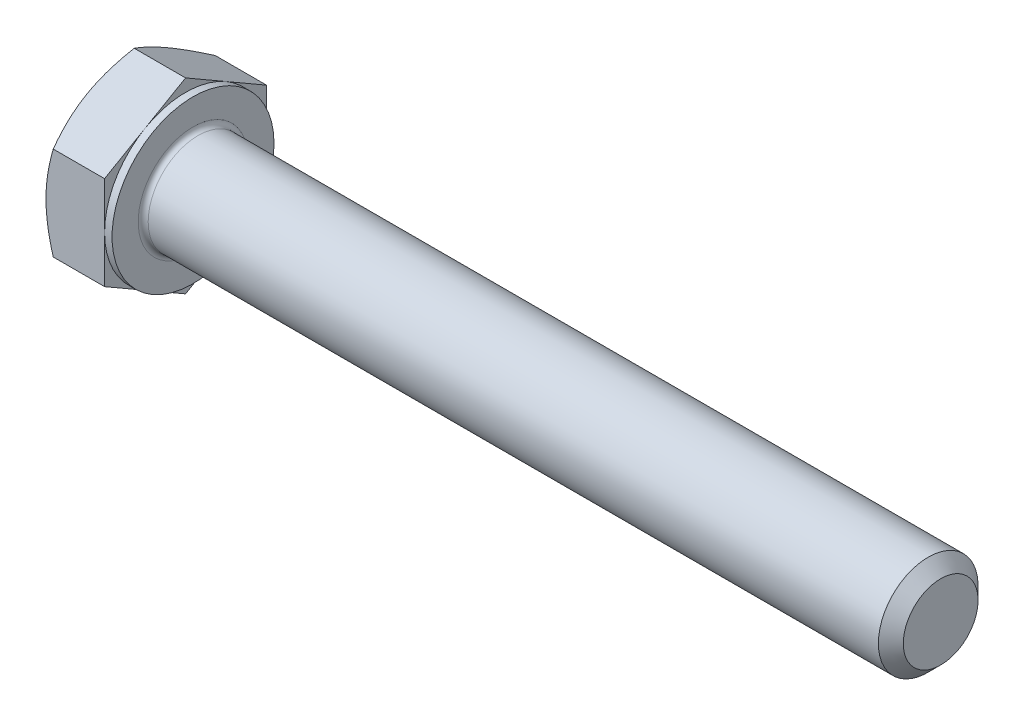
ISO-10303-21;
HEADER;
FILE_DESCRIPTION(('STEP AP214'),'2;1');
FILE_NAME('part.step','',(''),(''),'','','');
FILE_SCHEMA(('AUTOMOTIVE_DESIGN { 1 0 10303 214 1 1 1 1 }'));
ENDSEC;
DATA;
#1=APPLICATION_CONTEXT('core data for automotive mechanical design processes');
#2=APPLICATION_PROTOCOL_DEFINITION('international standard','automotive_design',2000,#1);
#3=PRODUCT_CONTEXT('',#1,'mechanical');
#4=PRODUCT('Part','Part','',(#3));
#5=PRODUCT_RELATED_PRODUCT_CATEGORY('part','',(#4));
#6=PRODUCT_DEFINITION_FORMATION('','',#4);
#7=PRODUCT_DEFINITION_CONTEXT('part definition',#1,'design');
#8=PRODUCT_DEFINITION('design','',#6,#7);
#9=PRODUCT_DEFINITION_SHAPE('','',#8);
#10=(LENGTH_UNIT() NAMED_UNIT(*) SI_UNIT(.MILLI.,.METRE.));
#11=(NAMED_UNIT(*) PLANE_ANGLE_UNIT() SI_UNIT($,.RADIAN.));
#12=(NAMED_UNIT(*) SI_UNIT($,.STERADIAN.) SOLID_ANGLE_UNIT());
#13=UNCERTAINTY_MEASURE_WITH_UNIT(LENGTH_MEASURE(1.E-05),#10,'distance_accuracy_value','');
#14=(GEOMETRIC_REPRESENTATION_CONTEXT(3) GLOBAL_UNCERTAINTY_ASSIGNED_CONTEXT((#13)) GLOBAL_UNIT_ASSIGNED_CONTEXT((#10,
#11,#12)) REPRESENTATION_CONTEXT('',''));
#15=CARTESIAN_POINT('',(0.,0.,0.));
#16=DIRECTION('',(0.,0.,1.));
#17=DIRECTION('',(1.,0.,0.));
#18=AXIS2_PLACEMENT_3D('',#15,#16,#17);
#19=CARTESIAN_POINT('',(5.3,3.75277674973256,-6.5));
#20=DIRECTION('',(0.,-0.866025403784438,0.500000000000001));
#21=DIRECTION('',(0.,-0.500000000000001,-0.866025403784438));
#22=AXIS2_PLACEMENT_3D('',#19,#20,#21);
#23=PLANE('',#22);
#24=DIRECTION('',(0.,0.500000000000001,0.866025403784438));
#25=VECTOR('',#24,1.);
#26=CARTESIAN_POINT('',(4.7,3.75277674973256,-6.5));
#27=LINE('',#26,#25);
#28=CARTESIAN_POINT('',(4.7,3.75277674973256,-6.5));
#29=VERTEX_POINT('',#28);
#30=CARTESIAN_POINT('',(4.7,5.62916512459885,-3.25));
#31=VERTEX_POINT('',#30);
#32=EDGE_CURVE('E176',#29,#31,#27,.T.);
#33=ORIENTED_EDGE('',*,*,#32,.F.);
#34=DIRECTION('',(-1.,0.,0.));
#35=VECTOR('',#34,1.);
#36=CARTESIAN_POINT('',(5.3,3.75277674973256,-6.5));
#37=LINE('',#36,#35);
#38=CARTESIAN_POINT('',(0.580556583600761,3.75277674973256,-6.5));
#39=VERTEX_POINT('',#38);
#40=EDGE_CURVE('E304',#29,#39,#37,.T.);
#41=ORIENTED_EDGE('',*,*,#40,.T.);
#42=CARTESIAN_POINT('',(0.580623251805869,7.50566896951898,0.0002));
#43=CARTESIAN_POINT('',(0.533004423075487,7.4231786300702,-0.14267745905888));
#44=CARTESIAN_POINT('',(0.487546700602708,7.34038072665458,-0.286087634534913));
#45=CARTESIAN_POINT('',(0.401548682023047,7.17411251123976,-0.574072631317195));
#46=CARTESIAN_POINT('',(0.361010507228027,7.09064192560665,-0.718647926571264));
#47=CARTESIAN_POINT('',(0.24757100112321,6.83889369625719,-1.15468865052003));
#48=CARTESIAN_POINT('',(0.183047807128741,6.66962231516081,-1.44787528284632));
#49=CARTESIAN_POINT('',(0.107386583547492,6.41631077211555,-1.88662374554437));
#50=CARTESIAN_POINT('',(0.0858328564569881,6.33302748139454,-2.03087463649469));
#51=CARTESIAN_POINT('',(0.0496903146061193,6.16608458377293,-2.32002821713809));
#52=CARTESIAN_POINT('',(0.0351008844596669,6.08242501078143,-2.46493084809889));
#53=CARTESIAN_POINT('',(0.0132587525073471,5.91496056339806,-2.75498777942832));
#54=CARTESIAN_POINT('',(0.00599772432210794,5.8311559625217,-2.90014160605421));
#55=CARTESIAN_POINT('',(-0.00103969741776869,5.66347396979287,-3.19057533697495));
#56=CARTESIAN_POINT('',(-0.000816322187795487,5.5795965802691,-3.33585523723636));
#57=CARTESIAN_POINT('',(0.010083458515165,5.34979921898453,-3.73387594242649));
#58=CARTESIAN_POINT('',(0.028381817869413,5.20395446807007,-3.98648646102757));
#59=CARTESIAN_POINT('',(0.0864063414576743,4.91323365606635,-4.49002967823568));
#60=CARTESIAN_POINT('',(0.126152338538243,4.76835861741226,-4.74096060593308));
#61=CARTESIAN_POINT('',(0.225505903202148,4.47705272008731,-5.24551722064432));
#62=CARTESIAN_POINT('',(0.285534425638025,4.33065861912702,-5.49907924143591));
#63=CARTESIAN_POINT('',(0.421774992509866,4.04005357906493,-6.00242193575904));
#64=CARTESIAN_POINT('',(0.497955034163591,3.89583891821181,-6.25220905555296));
#65=CARTESIAN_POINT('',(0.580623251805865,3.75266127967873,-6.5002));
#66=B_SPLINE_CURVE_WITH_KNOTS('',3,(#42,#43,#44,#45,#46,#47,#48,#49,#50,#51,#52,#53,#54,#55,#56,
#57,#58,#59,#60,#61,#62,#63,#64,#65),.UNSPECIFIED.,.F.,.F.,(4,2,2,2,2,2,2,2,2,2,2,4),(0.,
0.515105052395588,1.03043143507525,2.06322554824262,2.56697389547996,3.07067772176454,
3.57380860368928,4.0769239424252,4.9527935470566,5.82947446853466,6.72559912449737,
7.61996451221046),.UNSPECIFIED.);
#67=CARTESIAN_POINT('',(0.,5.62916512459885,-3.25000000000001));
#68=VERTEX_POINT('',#67);
#69=EDGE_CURVE('E231',#68,#39,#66,.T.);
#70=ORIENTED_EDGE('',*,*,#69,.F.);
#71=CARTESIAN_POINT('',(0.580556583600765,7.50555349946514,0.));
#72=VERTEX_POINT('',#71);
#73=EDGE_CURVE('E67',#72,#68,#66,.T.);
#74=ORIENTED_EDGE('',*,*,#73,.F.);
#75=DIRECTION('',(-1.,0.,0.));
#76=VECTOR('',#75,1.);
#77=CARTESIAN_POINT('',(5.3,7.50555349946514,0.));
#78=LINE('',#77,#76);
#79=CARTESIAN_POINT('',(4.7,7.50555349946514,0.));
#80=VERTEX_POINT('',#79);
#81=EDGE_CURVE('E296',#80,#72,#78,.T.);
#82=ORIENTED_EDGE('',*,*,#81,.F.);
#83=EDGE_CURVE('E174',#31,#80,#27,.T.);
#84=ORIENTED_EDGE('',*,*,#83,.F.);
#85=EDGE_LOOP('',(#33,#41,#70,#74,#82,#84));
#86=FACE_BOUND('',#85,.T.);
#87=ADVANCED_FACE('F44',(#86),#23,.F.);
#88=CARTESIAN_POINT('',(5.3,7.50555349946514,0.));
#89=DIRECTION('',(0.,-0.866025403784438,-0.500000000000001));
#90=DIRECTION('',(0.,0.500000000000001,-0.866025403784438));
#91=AXIS2_PLACEMENT_3D('',#88,#89,#90);
#92=PLANE('',#91);
#93=DIRECTION('',(0.,-0.500000000000001,0.866025403784438));
#94=VECTOR('',#93,1.);
#95=CARTESIAN_POINT('',(4.7,7.50555349946514,0.));
#96=LINE('',#95,#94);
#97=CARTESIAN_POINT('',(4.7,5.62916512459885,3.25000000000001));
#98=VERTEX_POINT('',#97);
#99=EDGE_CURVE('E173',#80,#98,#96,.T.);
#100=ORIENTED_EDGE('',*,*,#99,.F.);
#101=ORIENTED_EDGE('',*,*,#81,.T.);
#102=CARTESIAN_POINT('',(0.580623251805865,3.75266127967872,6.5002));
#103=CARTESIAN_POINT('',(0.533004423075483,3.8351516191275,6.35732254094112));
#104=CARTESIAN_POINT('',(0.487546700602704,3.91794952254312,6.21391236546509));
#105=CARTESIAN_POINT('',(0.401548682023044,4.08421773795794,5.9259273686828));
#106=CARTESIAN_POINT('',(0.361010507228023,4.16768832359105,5.78135207342873));
#107=CARTESIAN_POINT('',(0.247571001123207,4.41943655294051,5.34531134947996));
#108=CARTESIAN_POINT('',(0.183047807128738,4.58870793403689,5.05212471715368));
#109=CARTESIAN_POINT('',(0.10738658354749,4.84201947708215,4.61337625445563));
#110=CARTESIAN_POINT('',(0.0858328564569865,4.92530276780316,4.46912536350531));
#111=CARTESIAN_POINT('',(0.0496903146061183,5.09224566542477,4.17997178286191));
#112=CARTESIAN_POINT('',(0.035100884459666,5.17590523841627,4.03506915190111));
#113=CARTESIAN_POINT('',(0.0132587525073465,5.34336968579964,3.74501222057168));
#114=CARTESIAN_POINT('',(0.00599772432210779,5.427174286676,3.59985839394579));
#115=CARTESIAN_POINT('',(-0.00103969741776854,5.59485627940483,3.30942466302505));
#116=CARTESIAN_POINT('',(-0.000816322187795452,5.6787336689286,3.16414476276364));
#117=CARTESIAN_POINT('',(0.010083458515165,5.90853103021317,2.76612405757351));
#118=CARTESIAN_POINT('',(0.0283818178694132,6.05437578112763,2.51351353897243));
#119=CARTESIAN_POINT('',(0.0864063414576753,6.34509659313135,2.00997032176432));
#120=CARTESIAN_POINT('',(0.126152338538245,6.48997163178545,1.75903939406692));
#121=CARTESIAN_POINT('',(0.22550590320215,6.78127752911039,1.25448277935568));
#122=CARTESIAN_POINT('',(0.285534425638028,6.92767163007068,1.00092075856409));
#123=CARTESIAN_POINT('',(0.42177499250987,7.21827667013277,0.497578064240955));
#124=CARTESIAN_POINT('',(0.497955034163595,7.36249133098589,0.247790944447036));
#125=CARTESIAN_POINT('',(0.580623251805869,7.50566896951898,-0.000200000000000213));
#126=B_SPLINE_CURVE_WITH_KNOTS('',3,(#102,#103,#104,#105,#106,#107,#108,#109,#110,#111,#112,
#113,#114,#115,#116,#117,#118,#119,#120,#121,#122,#123,#124,#125),.UNSPECIFIED.,.F.,.F.,(4,2,2,
2,2,2,2,2,2,2,2,4),(0.,0.515105052395587,1.03043143507524,2.06322554824262,2.56697389547996,
3.07067772176454,3.57380860368928,4.0769239424252,4.9527935470566,5.82947446853466,
6.72559912449737,7.61996451221046),.UNSPECIFIED.);
#127=CARTESIAN_POINT('',(0.,5.62916512459885,3.25000000000001));
#128=VERTEX_POINT('',#127);
#129=EDGE_CURVE('E228',#128,#72,#126,.T.);
#130=ORIENTED_EDGE('',*,*,#129,.F.);
#131=CARTESIAN_POINT('',(0.58055658360076,3.75277674973256,6.5));
#132=VERTEX_POINT('',#131);
#133=EDGE_CURVE('E242',#132,#128,#126,.T.);
#134=ORIENTED_EDGE('',*,*,#133,.F.);
#135=DIRECTION('',(-1.,0.,0.));
#136=VECTOR('',#135,1.);
#137=CARTESIAN_POINT('',(5.3,3.75277674973256,6.5));
#138=LINE('',#137,#136);
#139=CARTESIAN_POINT('',(4.7,3.75277674973256,6.5));
#140=VERTEX_POINT('',#139);
#141=EDGE_CURVE('E298',#140,#132,#138,.T.);
#142=ORIENTED_EDGE('',*,*,#141,.F.);
#143=EDGE_CURVE('E141',#98,#140,#96,.T.);
#144=ORIENTED_EDGE('',*,*,#143,.F.);
#145=EDGE_LOOP('',(#100,#101,#130,#134,#142,#144));
#146=FACE_BOUND('',#145,.T.);
#147=ADVANCED_FACE('F249',(#146),#92,.F.);
#148=CARTESIAN_POINT('',(5.3,3.75277674973256,6.5));
#149=DIRECTION('',(0.,0.,-1.));
#150=DIRECTION('',(0.,1.,0.));
#151=AXIS2_PLACEMENT_3D('',#148,#149,#150);
#152=PLANE('',#151);
#153=DIRECTION('',(0.,-1.,0.));
#154=VECTOR('',#153,1.);
#155=CARTESIAN_POINT('',(4.7,3.75277674973256,6.5));
#156=LINE('',#155,#154);
#157=CARTESIAN_POINT('',(4.7,0.,6.5));
#158=VERTEX_POINT('',#157);
#159=EDGE_CURVE('E135',#140,#158,#156,.T.);
#160=ORIENTED_EDGE('',*,*,#159,.F.);
#161=ORIENTED_EDGE('',*,*,#141,.T.);
#162=CARTESIAN_POINT('',(3.18835311590246,-10.1137456678934,6.5));
#163=CARTESIAN_POINT('',(3.05034774010468,-9.82952666322138,6.5));
#164=CARTESIAN_POINT('',(2.91365616489938,-9.54465869649274,6.5));
#165=CARTESIAN_POINT('',(2.64363899497541,-8.97327978057922,6.5));
#166=CARTESIAN_POINT('',(2.51031392459097,-8.68676858388472,6.5));
#167=CARTESIAN_POINT('',(2.24710473482719,-8.11029837842689,6.5));
#168=CARTESIAN_POINT('',(2.1172430043868,-7.82032911201512,6.5));
#169=CARTESIAN_POINT('',(1.86279082826903,-7.2380954102234,6.5));
#170=CARTESIAN_POINT('',(1.73820013554674,-6.94583108317207,6.5));
#171=CARTESIAN_POINT('',(1.49176685426961,-6.34906440963036,6.5));
#172=CARTESIAN_POINT('',(1.37014257641265,-6.04447142288872,6.5));
#173=CARTESIAN_POINT('',(1.13601865758149,-5.43173420957315,6.5));
#174=CARTESIAN_POINT('',(1.02352003558022,-5.12358959079846,6.5));
#175=CARTESIAN_POINT('',(0.810575368239917,-4.5038256978226,6.5));
#176=CARTESIAN_POINT('',(0.710105232302005,-4.19221478266993,6.5));
#177=CARTESIAN_POINT('',(0.524420166144454,-3.56452019206012,6.5));
#178=CARTESIAN_POINT('',(0.439200468206418,-3.24843794792921,6.5));
#179=CARTESIAN_POINT('',(0.288524223401198,-2.61335465712783,6.5));
#180=CARTESIAN_POINT('',(0.222961865744749,-2.29437912059505,6.5));
#181=CARTESIAN_POINT('',(0.115312883130725,-1.65238219405863,6.5));
#182=CARTESIAN_POINT('',(0.0732239014690639,-1.3293612135443,6.5));
#183=CARTESIAN_POINT('',(0.0304887136381667,-0.845231171839986,6.5));
#184=CARTESIAN_POINT('',(0.0196493434273843,-0.684982209663103,6.5));
#185=CARTESIAN_POINT('',(0.00475298486143982,-0.36416234906546,6.5));
#186=CARTESIAN_POINT('',(0.000695882908832042,-0.203591456081879,6.5));
#187=CARTESIAN_POINT('',(-0.000531597190094996,0.117577430374297,6.5));
#188=CARTESIAN_POINT('',(0.00229809017012694,0.278175424090143,6.5));
#189=CARTESIAN_POINT('',(0.0147726845547639,0.599108972823505,6.5));
#190=CARTESIAN_POINT('',(0.0244179260500518,0.759444514574217,6.5));
#191=CARTESIAN_POINT('',(0.0554961939343001,1.14369946602534,6.5));
#192=CARTESIAN_POINT('',(0.0801030490514518,1.36736763045086,6.5));
#193=CARTESIAN_POINT('',(0.141246537453378,1.81305591311688,6.5));
#194=CARTESIAN_POINT('',(0.177784759614452,2.03507580783108,6.5));
#195=CARTESIAN_POINT('',(0.303360001332115,2.69839633433796,6.5));
#196=CARTESIAN_POINT('',(0.408335815147595,3.13672010374357,6.5));
#197=CARTESIAN_POINT('',(0.59056459313494,3.79232112918118,6.5));
#198=CARTESIAN_POINT('',(0.656313198979091,4.01299150874073,6.5));
#199=CARTESIAN_POINT('',(0.794681634200732,4.45218859008391,6.5));
#200=CARTESIAN_POINT('',(0.867301513122617,4.67071527639819,6.5));
#201=CARTESIAN_POINT('',(1.01824353854295,5.10569490252726,6.5));
#202=CARTESIAN_POINT('',(1.09656388232839,5.32214847365075,6.5));
#203=CARTESIAN_POINT('',(1.25798086164821,5.75325725773039,6.5));
#204=CARTESIAN_POINT('',(1.34107741035995,5.96791250329556,6.5));
#205=CARTESIAN_POINT('',(1.56029019583041,6.51888445936372,6.5));
#206=CARTESIAN_POINT('',(1.69936356666534,6.85402316813627,6.5));
#207=CARTESIAN_POINT('',(1.98501958087353,7.52109583939393,6.5));
#208=CARTESIAN_POINT('',(2.13160288780791,7.85302951559933,6.5));
#209=CARTESIAN_POINT('',(2.43059748044951,8.51437865518657,6.5));
#210=CARTESIAN_POINT('',(2.58301057596959,8.84379329784093,6.5));
#211=CARTESIAN_POINT('',(2.89234869374926,9.50047798683784,6.5));
#212=CARTESIAN_POINT('',(3.04927357220058,9.82774810112757,6.5));
#213=CARTESIAN_POINT('',(3.36692013130636,10.4809971975748,6.5));
#214=CARTESIAN_POINT('',(3.52764676491733,10.8069737667408,6.5));
#215=CARTESIAN_POINT('',(3.85198555554899,11.4574882901034,6.5));
#216=CARTESIAN_POINT('',(4.01559773123065,11.7820262349792,6.5));
#217=CARTESIAN_POINT('',(4.50986185003773,12.7537468114441,6.5));
#218=CARTESIAN_POINT('',(4.84399997978541,13.3991555932469,6.5));
#219=CARTESIAN_POINT('',(5.48575990265919,14.6239779290894,6.5));
#220=CARTESIAN_POINT('',(5.79279643372278,15.2036995760604,6.5));
#221=CARTESIAN_POINT('',(6.4106918822763,16.3611382637875,6.5));
#222=CARTESIAN_POINT('',(6.72155099010109,16.938855202873,6.5));
#223=CARTESIAN_POINT('',(7.34519775439014,18.0910273555999,6.5));
#224=CARTESIAN_POINT('',(7.65797694168864,18.665487160613,6.5));
#225=CARTESIAN_POINT('',(8.28574397153078,19.8131486204439,6.5));
#226=CARTESIAN_POINT('',(8.60073166294279,20.3863503578957,6.5));
#227=CARTESIAN_POINT('',(8.91652967168741,20.9591024521449,6.5));
#228=B_SPLINE_CURVE_WITH_KNOTS('',3,(#162,#163,#164,#165,#166,#167,#168,#169,#170,#171,#172,
#173,#174,#175,#176,#177,#178,#179,#180,#181,#182,#183,#184,#185,#186,#187,#188,#189,#190,#191,
#192,#193,#194,#195,#196,#197,#198,#199,#200,#201,#202,#203,#204,#205,#206,#207,#208,#209,#210,
#211,#212,#213,#214,#215,#216,#217,#218,#219,#220,#221,#222,#223,#224,#225,#226,#227),
.UNSPECIFIED.,.F.,.F.,(4,2,2,2,2,2,2,2,2,2,2,2,2,2,2,2,2,2,2,2,2,2,2,2,2,2,2,2,2,2,2,2,4),(0.,
0.947868666702312,1.89588406483492,2.84900320930536,3.80207763304315,4.78589774082711,
5.76982755141752,6.75175256246685,7.73337005764394,8.70960474890991,9.68574140951124,
10.1674651053568,10.6491807326436,11.1309009419855,11.6126447932157,12.287317572382,
12.9620802330383,14.312318438093,15.0030310344276,15.6937486114326,16.3842486973571,
17.0747362352244,18.1631508683747,19.2516618378194,20.3405135142583,21.4293305231019,
22.5196540547637,23.6099846401957,25.7902468235016,27.7582608872418,29.7263733429304,
31.6886408595598,33.6507753806319),.UNSPECIFIED.);
#229=CARTESIAN_POINT('',(0.,0.,6.5));
#230=VERTEX_POINT('',#229);
#231=EDGE_CURVE('E243',#230,#132,#228,.T.);
#232=ORIENTED_EDGE('',*,*,#231,.F.);
#233=CARTESIAN_POINT('',(0.580556583600765,-3.75277674973258,6.5));
#234=VERTEX_POINT('',#233);
#235=EDGE_CURVE('E305',#234,#230,#228,.T.);
#236=ORIENTED_EDGE('',*,*,#235,.F.);
#237=DIRECTION('',(-1.,0.,0.));
#238=VECTOR('',#237,1.);
#239=CARTESIAN_POINT('',(5.3,-3.75277674973258,6.5));
#240=LINE('',#239,#238);
#241=CARTESIAN_POINT('',(4.7,-3.75277674973258,6.5));
#242=VERTEX_POINT('',#241);
#243=EDGE_CURVE('E167',#242,#234,#240,.T.);
#244=ORIENTED_EDGE('',*,*,#243,.F.);
#245=EDGE_CURVE('E145',#158,#242,#156,.T.);
#246=ORIENTED_EDGE('',*,*,#245,.F.);
#247=EDGE_LOOP('',(#160,#161,#232,#236,#244,#246));
#248=FACE_BOUND('',#247,.T.);
#249=ADVANCED_FACE('F165',(#248),#152,.F.);
#250=CARTESIAN_POINT('',(5.3,-7.50555349946515,0.));
#251=DIRECTION('',(0.,0.866025403784438,-0.500000000000001));
#252=DIRECTION('',(0.,0.500000000000001,0.866025403784438));
#253=AXIS2_PLACEMENT_3D('',#250,#251,#252);
#254=PLANE('',#253);
#255=DIRECTION('',(0.,-0.500000000000001,-0.866025403784438));
#256=VECTOR('',#255,1.);
#257=CARTESIAN_POINT('',(4.7,-7.50555349946515,0.));
#258=LINE('',#257,#256);
#259=CARTESIAN_POINT('',(4.7,-5.62916512459885,3.25));
#260=VERTEX_POINT('',#259);
#261=EDGE_CURVE('E152',#242,#260,#258,.T.);
#262=ORIENTED_EDGE('',*,*,#261,.F.);
#263=ORIENTED_EDGE('',*,*,#243,.T.);
#264=CARTESIAN_POINT('',(0.580623251805877,-7.50566896951899,-0.000199999999999834));
#265=CARTESIAN_POINT('',(0.533004423075495,-7.42317863007021,0.14267745905888));
#266=CARTESIAN_POINT('',(0.487546700602716,-7.3403807266546,0.286087634534913));
#267=CARTESIAN_POINT('',(0.401548682023055,-7.17411251123977,0.574072631317195));
#268=CARTESIAN_POINT('',(0.361010507228034,-7.09064192560666,0.718647926571265));
#269=CARTESIAN_POINT('',(0.247571001123217,-6.8388936962572,1.15468865052004));
#270=CARTESIAN_POINT('',(0.183047807128748,-6.66962231516082,1.44787528284632));
#271=CARTESIAN_POINT('',(0.107386583547499,-6.41631077211556,1.88662374554438));
#272=CARTESIAN_POINT('',(0.0858328564569948,-6.33302748139455,2.03087463649469));
#273=CARTESIAN_POINT('',(0.049690314606126,-6.16608458377294,2.32002821713809));
#274=CARTESIAN_POINT('',(0.0351008844596736,-6.08242501078144,2.46493084809889));
#275=CARTESIAN_POINT('',(0.0132587525073536,-5.91496056339808,2.75498777942833));
#276=CARTESIAN_POINT('',(0.00599772432211453,-5.83115596252171,2.90014160605422));
#277=CARTESIAN_POINT('',(-0.001039697417762,-5.66347396979288,3.19057533697495));
#278=CARTESIAN_POINT('',(-0.000816322187788739,-5.57959658026911,3.33585523723636));
#279=CARTESIAN_POINT('',(0.0100834585151718,-5.34979921898454,3.7338759424265));
#280=CARTESIAN_POINT('',(0.0283818178694196,-5.20395446807008,3.98648646102758));
#281=CARTESIAN_POINT('',(0.0864063414576807,-4.91323365606637,4.49002967823568));
#282=CARTESIAN_POINT('',(0.12615233853825,-4.76835861741227,4.74096060593309));
#283=CARTESIAN_POINT('',(0.225505903202154,-4.47705272008733,5.24551722064432));
#284=CARTESIAN_POINT('',(0.28553442563803,-4.33065861912704,5.49907924143592));
#285=CARTESIAN_POINT('',(0.421774992509871,-4.04005357906495,6.00242193575905));
#286=CARTESIAN_POINT('',(0.497955034163595,-3.89583891821182,6.25220905555296));
#287=CARTESIAN_POINT('',(0.580623251805869,-3.75266127967874,6.5002));
#288=B_SPLINE_CURVE_WITH_KNOTS('',3,(#264,#265,#266,#267,#268,#269,#270,#271,#272,#273,#274,
#275,#276,#277,#278,#279,#280,#281,#282,#283,#284,#285,#286,#287),.UNSPECIFIED.,.F.,.F.,(4,2,2,
2,2,2,2,2,2,2,2,4),(0.,0.515105052395588,1.03043143507525,2.06322554824263,2.56697389547997,
3.07067772176454,3.57380860368929,4.07692394242521,4.95279354705661,5.82947446853467,
6.72559912449737,7.61996451221046),.UNSPECIFIED.);
#289=CARTESIAN_POINT('',(0.,-5.62916512459885,3.25000000000001));
#290=VERTEX_POINT('',#289);
#291=EDGE_CURVE('E230',#290,#234,#288,.T.);
#292=ORIENTED_EDGE('',*,*,#291,.F.);
#293=CARTESIAN_POINT('',(0.580556583600772,-7.50555349946515,0.));
#294=VERTEX_POINT('',#293);
#295=EDGE_CURVE('E222',#294,#290,#288,.T.);
#296=ORIENTED_EDGE('',*,*,#295,.F.);
#297=DIRECTION('',(-1.,0.,0.));
#298=VECTOR('',#297,1.);
#299=CARTESIAN_POINT('',(5.3,-7.50555349946515,0.));
#300=LINE('',#299,#298);
#301=CARTESIAN_POINT('',(4.7,-7.50555349946515,0.));
#302=VERTEX_POINT('',#301);
#303=EDGE_CURVE('E301',#302,#294,#300,.T.);
#304=ORIENTED_EDGE('',*,*,#303,.F.);
#305=EDGE_CURVE('E168',#260,#302,#258,.T.);
#306=ORIENTED_EDGE('',*,*,#305,.F.);
#307=EDGE_LOOP('',(#262,#263,#292,#296,#304,#306));
#308=FACE_BOUND('',#307,.T.);
#309=ADVANCED_FACE('F213',(#308),#254,.F.);
#310=CARTESIAN_POINT('',(5.3,-3.75277674973258,-6.5));
#311=DIRECTION('',(0.,0.866025403784438,0.500000000000001));
#312=DIRECTION('',(0.,-0.500000000000001,0.866025403784438));
#313=AXIS2_PLACEMENT_3D('',#310,#311,#312);
#314=PLANE('',#313);
#315=DIRECTION('',(0.,0.500000000000001,-0.866025403784438));
#316=VECTOR('',#315,1.);
#317=CARTESIAN_POINT('',(4.7,-3.75277674973258,-6.5));
#318=LINE('',#317,#316);
#319=CARTESIAN_POINT('',(4.7,-5.62916512459885,-3.25));
#320=VERTEX_POINT('',#319);
#321=EDGE_CURVE('E351',#302,#320,#318,.T.);
#322=ORIENTED_EDGE('',*,*,#321,.F.);
#323=ORIENTED_EDGE('',*,*,#303,.T.);
#324=CARTESIAN_POINT('',(0.580623251805869,-3.75266127967874,-6.5002));
#325=CARTESIAN_POINT('',(0.533004423075488,-3.83515161912751,-6.35732254094112));
#326=CARTESIAN_POINT('',(0.487546700602708,-3.91794952254313,-6.21391236546509));
#327=CARTESIAN_POINT('',(0.401548682023049,-4.08421773795795,-5.92592736868281));
#328=CARTESIAN_POINT('',(0.361010507228029,-4.16768832359106,-5.78135207342874));
#329=CARTESIAN_POINT('',(0.247571001123213,-4.41943655294052,-5.34531134947997));
#330=CARTESIAN_POINT('',(0.183047807128744,-4.58870793403691,-5.05212471715368));
#331=CARTESIAN_POINT('',(0.107386583547496,-4.84201947708216,-4.61337625445563));
#332=CARTESIAN_POINT('',(0.085832856456992,-4.92530276780317,-4.46912536350531));
#333=CARTESIAN_POINT('',(0.0496903146061239,-5.09224566542478,-4.17997178286191));
#334=CARTESIAN_POINT('',(0.035100884459672,-5.17590523841629,-4.03506915190111));
#335=CARTESIAN_POINT('',(0.0132587525073528,-5.34336968579965,-3.74501222057168));
#336=CARTESIAN_POINT('',(0.00599772432211393,-5.42717428667601,-3.59985839394579));
#337=CARTESIAN_POINT('',(-0.00103969741776215,-5.59485627940485,-3.30942466302505));
#338=CARTESIAN_POINT('',(-0.000816322187788696,-5.67873366892861,-3.16414476276364));
#339=CARTESIAN_POINT('',(0.0100834585151724,-5.90853103021318,-2.76612405757351));
#340=CARTESIAN_POINT('',(0.0283818178694207,-6.05437578112765,-2.51351353897243));
#341=CARTESIAN_POINT('',(0.086406341457683,-6.34509659313136,-2.00997032176432));
#342=CARTESIAN_POINT('',(0.126152338538253,-6.48997163178546,-1.75903939406692));
#343=CARTESIAN_POINT('',(0.225505903202158,-6.7812775291104,-1.25448277935568));
#344=CARTESIAN_POINT('',(0.285534425638035,-6.92767163007069,-1.00092075856409));
#345=CARTESIAN_POINT('',(0.421774992509877,-7.21827667013278,-0.497578064240955));
#346=CARTESIAN_POINT('',(0.497955034163602,-7.3624913309859,-0.247790944447036));
#347=CARTESIAN_POINT('',(0.580623251805876,-7.50566896951899,0.000199999999999993));
#348=B_SPLINE_CURVE_WITH_KNOTS('',3,(#324,#325,#326,#327,#328,#329,#330,#331,#332,#333,#334,
#335,#336,#337,#338,#339,#340,#341,#342,#343,#344,#345,#346,#347),.UNSPECIFIED.,.F.,.F.,(4,2,2,
2,2,2,2,2,2,2,2,4),(0.,0.515105052395587,1.03043143507524,2.06322554824262,2.56697389547996,
3.07067772176454,3.57380860368928,4.0769239424252,4.9527935470566,5.82947446853466,
6.72559912449736,7.61996451221046),.UNSPECIFIED.);
#349=CARTESIAN_POINT('',(0.,-5.62916512459885,-3.25));
#350=VERTEX_POINT('',#349);
#351=EDGE_CURVE('E229',#350,#294,#348,.T.);
#352=ORIENTED_EDGE('',*,*,#351,.F.);
#353=CARTESIAN_POINT('',(0.580556583600765,-3.75277674973258,-6.5));
#354=VERTEX_POINT('',#353);
#355=EDGE_CURVE('E190',#354,#350,#348,.T.);
#356=ORIENTED_EDGE('',*,*,#355,.F.);
#357=DIRECTION('',(-1.,0.,0.));
#358=VECTOR('',#357,1.);
#359=CARTESIAN_POINT('',(5.3,-3.75277674973258,-6.5));
#360=LINE('',#359,#358);
#361=CARTESIAN_POINT('',(4.7,-3.75277674973258,-6.5));
#362=VERTEX_POINT('',#361);
#363=EDGE_CURVE('E303',#362,#354,#360,.T.);
#364=ORIENTED_EDGE('',*,*,#363,.F.);
#365=EDGE_CURVE('E163',#320,#362,#318,.T.);
#366=ORIENTED_EDGE('',*,*,#365,.F.);
#367=EDGE_LOOP('',(#322,#323,#352,#356,#364,#366));
#368=FACE_BOUND('',#367,.T.);
#369=ADVANCED_FACE('F206',(#368),#314,.F.);
#370=CARTESIAN_POINT('',(5.3,3.75277674973256,-6.5));
#371=DIRECTION('',(0.,0.,1.));
#372=DIRECTION('',(0.,-1.,0.));
#373=AXIS2_PLACEMENT_3D('',#370,#371,#372);
#374=PLANE('',#373);
#375=DIRECTION('',(0.,1.,0.));
#376=VECTOR('',#375,1.);
#377=CARTESIAN_POINT('',(4.7,3.75277674973256,-6.5));
#378=LINE('',#377,#376);
#379=CARTESIAN_POINT('',(4.7,0.,-6.5));
#380=VERTEX_POINT('',#379);
#381=EDGE_CURVE('E275',#362,#380,#378,.T.);
#382=ORIENTED_EDGE('',*,*,#381,.F.);
#383=ORIENTED_EDGE('',*,*,#363,.T.);
#384=CARTESIAN_POINT('',(3.18835311590246,-10.1137456678934,-6.5));
#385=CARTESIAN_POINT('',(3.05034774010468,-9.82952666322138,-6.5));
#386=CARTESIAN_POINT('',(2.91365616489938,-9.54465869649274,-6.5));
#387=CARTESIAN_POINT('',(2.64363899497542,-8.97327978057922,-6.5));
#388=CARTESIAN_POINT('',(2.51031392459097,-8.68676858388472,-6.5));
#389=CARTESIAN_POINT('',(2.24710473482719,-8.11029837842689,-6.5));
#390=CARTESIAN_POINT('',(2.1172430043868,-7.82032911201512,-6.5));
#391=CARTESIAN_POINT('',(1.86279082826903,-7.2380954102234,-6.5));
#392=CARTESIAN_POINT('',(1.73820013554675,-6.94583108317207,-6.5));
#393=CARTESIAN_POINT('',(1.49176685426962,-6.34906440963036,-6.5));
#394=CARTESIAN_POINT('',(1.37014257641266,-6.04447142288872,-6.5));
#395=CARTESIAN_POINT('',(1.13601865758149,-5.43173420957316,-6.5));
#396=CARTESIAN_POINT('',(1.02352003558022,-5.12358959079846,-6.5));
#397=CARTESIAN_POINT('',(0.810575368239919,-4.5038256978226,-6.5));
#398=CARTESIAN_POINT('',(0.710105232302007,-4.19221478266993,-6.5));
#399=CARTESIAN_POINT('',(0.524420166144455,-3.56452019206012,-6.5));
#400=CARTESIAN_POINT('',(0.439200468206419,-3.24843794792921,-6.5));
#401=CARTESIAN_POINT('',(0.288524223401198,-2.61335465712783,-6.5));
#402=CARTESIAN_POINT('',(0.222961865744749,-2.29437912059505,-6.5));
#403=CARTESIAN_POINT('',(0.115312883130726,-1.65238219405862,-6.5));
#404=CARTESIAN_POINT('',(0.0732239014690635,-1.3293612135443,-6.5));
#405=CARTESIAN_POINT('',(0.0304887136381666,-0.845231171839984,-6.5));
#406=CARTESIAN_POINT('',(0.0196493434273846,-0.684982209663101,-6.5));
#407=CARTESIAN_POINT('',(0.0047529848614402,-0.364162349065459,-6.5));
#408=CARTESIAN_POINT('',(0.000695882908832254,-0.203591456081878,-6.5));
#409=CARTESIAN_POINT('',(-0.000531597190094705,0.117577430374298,-6.5));
#410=CARTESIAN_POINT('',(0.00229809017012751,0.278175424090144,-6.5));
#411=CARTESIAN_POINT('',(0.0147726845547647,0.599108972823507,-6.5));
#412=CARTESIAN_POINT('',(0.0244179260500526,0.759444514574219,-6.5));
#413=CARTESIAN_POINT('',(0.0554961939343006,1.14369946602534,-6.5));
#414=CARTESIAN_POINT('',(0.0801030490514521,1.36736763045086,-6.5));
#415=CARTESIAN_POINT('',(0.141246537453378,1.81305591311688,-6.5));
#416=CARTESIAN_POINT('',(0.177784759614452,2.03507580783108,-6.5));
#417=CARTESIAN_POINT('',(0.303360001332115,2.69839633433795,-6.5));
#418=CARTESIAN_POINT('',(0.408335815147594,3.13672010374357,-6.5));
#419=CARTESIAN_POINT('',(0.59056459313494,3.79232112918118,-6.5));
#420=CARTESIAN_POINT('',(0.656313198979091,4.01299150874073,-6.5));
#421=CARTESIAN_POINT('',(0.794681634200732,4.45218859008391,-6.5));
#422=CARTESIAN_POINT('',(0.867301513122617,4.67071527639819,-6.5));
#423=CARTESIAN_POINT('',(1.01824353854295,5.10569490252726,-6.5));
#424=CARTESIAN_POINT('',(1.09656388232839,5.32214847365075,-6.5));
#425=CARTESIAN_POINT('',(1.25798086164821,5.75325725773039,-6.5));
#426=CARTESIAN_POINT('',(1.34107741035995,5.96791250329556,-6.5));
#427=CARTESIAN_POINT('',(1.56029019583041,6.51888445936372,-6.5));
#428=CARTESIAN_POINT('',(1.69936356666534,6.85402316813626,-6.5));
#429=CARTESIAN_POINT('',(1.98501958087353,7.52109583939393,-6.5));
#430=CARTESIAN_POINT('',(2.13160288780791,7.85302951559933,-6.5));
#431=CARTESIAN_POINT('',(2.43059748044951,8.51437865518657,-6.5));
#432=CARTESIAN_POINT('',(2.58301057596959,8.84379329784094,-6.5));
#433=CARTESIAN_POINT('',(2.89234869374926,9.50047798683784,-6.5));
#434=CARTESIAN_POINT('',(3.04927357220059,9.82774810112757,-6.5));
#435=CARTESIAN_POINT('',(3.36692013130636,10.4809971975748,-6.5));
#436=CARTESIAN_POINT('',(3.52764676491733,10.8069737667408,-6.5));
#437=CARTESIAN_POINT('',(3.85198555554899,11.4574882901034,-6.5));
#438=CARTESIAN_POINT('',(4.01559773123066,11.7820262349792,-6.5));
#439=CARTESIAN_POINT('',(4.50986185003773,12.7537468114441,-6.5));
#440=CARTESIAN_POINT('',(4.84399997978541,13.3991555932469,-6.5));
#441=CARTESIAN_POINT('',(5.48575990265919,14.6239779290894,-6.5));
#442=CARTESIAN_POINT('',(5.79279643372279,15.2036995760604,-6.5));
#443=CARTESIAN_POINT('',(6.4106918822763,16.3611382637875,-6.5));
#444=CARTESIAN_POINT('',(6.72155099010109,16.938855202873,-6.5));
#445=CARTESIAN_POINT('',(7.34519775439015,18.0910273555999,-6.5));
#446=CARTESIAN_POINT('',(7.65797694168864,18.665487160613,-6.5));
#447=CARTESIAN_POINT('',(8.28574397153078,19.8131486204439,-6.5));
#448=CARTESIAN_POINT('',(8.60073166294279,20.3863503578957,-6.5));
#449=CARTESIAN_POINT('',(8.91652967168742,20.9591024521449,-6.49999999999999));
#450=B_SPLINE_CURVE_WITH_KNOTS('',3,(#384,#385,#386,#387,#388,#389,#390,#391,#392,#393,#394,
#395,#396,#397,#398,#399,#400,#401,#402,#403,#404,#405,#406,#407,#408,#409,#410,#411,#412,#413,
#414,#415,#416,#417,#418,#419,#420,#421,#422,#423,#424,#425,#426,#427,#428,#429,#430,#431,#432,
#433,#434,#435,#436,#437,#438,#439,#440,#441,#442,#443,#444,#445,#446,#447,#448,#449),
.UNSPECIFIED.,.F.,.F.,(4,2,2,2,2,2,2,2,2,2,2,2,2,2,2,2,2,2,2,2,2,2,2,2,2,2,2,2,2,2,2,2,4),(0.,
0.947868666702312,1.89588406483492,2.84900320930536,3.80207763304314,4.7858977408271,
5.76982755141752,6.75175256246685,7.73337005764394,8.70960474890992,9.68574140951124,
10.1674651053568,10.6491807326436,11.1309009419855,11.6126447932157,12.287317572382,
12.9620802330384,14.312318438093,15.0030310344276,15.6937486114326,16.3842486973571,
17.0747362352244,18.1631508683747,19.2516618378194,20.3405135142583,21.4293305231019,
22.5196540547637,23.6099846401957,25.7902468235017,27.7582608872418,29.7263733429304,
31.6886408595598,33.6507753806319),.UNSPECIFIED.);
#451=CARTESIAN_POINT('',(0.,0.,-6.5));
#452=VERTEX_POINT('',#451);
#453=EDGE_CURVE('E180',#452,#354,#450,.F.);
#454=ORIENTED_EDGE('',*,*,#453,.F.);
#455=EDGE_CURVE('E189',#39,#452,#450,.F.);
#456=ORIENTED_EDGE('',*,*,#455,.F.);
#457=ORIENTED_EDGE('',*,*,#40,.F.);
#458=EDGE_CURVE('E279',#380,#29,#378,.T.);
#459=ORIENTED_EDGE('',*,*,#458,.F.);
#460=EDGE_LOOP('',(#382,#383,#454,#456,#457,#459));
#461=FACE_BOUND('',#460,.T.);
#462=ADVANCED_FACE('F201',(#461),#374,.F.);
#463=CARTESIAN_POINT('',(0.,0.,0.));
#464=DIRECTION('',(1.,0.,0.));
#465=DIRECTION('',(0.,0.,-1.));
#466=AXIS2_PLACEMENT_3D('',#463,#464,#465);
#467=CONICAL_SURFACE('',#466,6.5,1.0471975511966);
#468=ORIENTED_EDGE('',*,*,#355,.T.);
#469=CARTESIAN_POINT('',(0.,0.,0.));
#470=DIRECTION('',(1.,0.,0.));
#471=DIRECTION('',(0.,0.,-1.));
#472=AXIS2_PLACEMENT_3D('',#469,#470,#471);
#473=CIRCLE('',#472,6.5);
#474=EDGE_CURVE('E292',#350,#452,#473,.T.);
#475=ORIENTED_EDGE('',*,*,#474,.T.);
#476=ORIENTED_EDGE('',*,*,#453,.T.);
#477=EDGE_LOOP('',(#468,#475,#476));
#478=FACE_BOUND('',#477,.T.);
#479=ADVANCED_FACE('F205',(#478),#467,.T.);
#480=ORIENTED_EDGE('',*,*,#295,.T.);
#481=EDGE_CURVE('E295',#290,#350,#473,.T.);
#482=ORIENTED_EDGE('',*,*,#481,.T.);
#483=ORIENTED_EDGE('',*,*,#351,.T.);
#484=EDGE_LOOP('',(#480,#482,#483));
#485=FACE_BOUND('',#484,.T.);
#486=ADVANCED_FACE('F348',(#485),#467,.T.);
#487=ORIENTED_EDGE('',*,*,#235,.T.);
#488=EDGE_CURVE('E325',#230,#290,#473,.T.);
#489=ORIENTED_EDGE('',*,*,#488,.T.);
#490=ORIENTED_EDGE('',*,*,#291,.T.);
#491=EDGE_LOOP('',(#487,#489,#490));
#492=FACE_BOUND('',#491,.T.);
#493=ADVANCED_FACE('F197',(#492),#467,.T.);
#494=ORIENTED_EDGE('',*,*,#231,.T.);
#495=ORIENTED_EDGE('',*,*,#133,.T.);
#496=CARTESIAN_POINT('',(0.,0.,0.));
#497=DIRECTION('',(-1.,0.,0.));
#498=DIRECTION('',(0.,0.,1.));
#499=AXIS2_PLACEMENT_3D('',#496,#497,#498);
#500=CIRCLE('',#499,6.5);
#501=EDGE_CURVE('E177',#230,#128,#500,.T.);
#502=ORIENTED_EDGE('',*,*,#501,.F.);
#503=EDGE_LOOP('',(#494,#495,#502));
#504=FACE_BOUND('',#503,.T.);
#505=ADVANCED_FACE('F319',(#504),#467,.T.);
#506=ORIENTED_EDGE('',*,*,#129,.T.);
#507=ORIENTED_EDGE('',*,*,#73,.T.);
#508=EDGE_CURVE('E290',#68,#128,#473,.T.);
#509=ORIENTED_EDGE('',*,*,#508,.T.);
#510=EDGE_LOOP('',(#506,#507,#509));
#511=FACE_BOUND('',#510,.T.);
#512=ADVANCED_FACE('F323',(#511),#467,.T.);
#513=ORIENTED_EDGE('',*,*,#69,.T.);
#514=ORIENTED_EDGE('',*,*,#455,.T.);
#515=EDGE_CURVE('E289',#452,#68,#473,.T.);
#516=ORIENTED_EDGE('',*,*,#515,.T.);
#517=EDGE_LOOP('',(#513,#514,#516));
#518=FACE_BOUND('',#517,.T.);
#519=ADVANCED_FACE('F339',(#518),#467,.T.);
#520=CARTESIAN_POINT('',(0.,7.50555349946514,0.));
#521=DIRECTION('',(1.,0.,0.));
#522=DIRECTION('',(0.,0.,-1.));
#523=AXIS2_PLACEMENT_3D('',#520,#521,#522);
#524=PLANE('',#523);
#525=ORIENTED_EDGE('',*,*,#515,.F.);
#526=ORIENTED_EDGE('',*,*,#474,.F.);
#527=ORIENTED_EDGE('',*,*,#481,.F.);
#528=ORIENTED_EDGE('',*,*,#488,.F.);
#529=ORIENTED_EDGE('',*,*,#501,.T.);
#530=ORIENTED_EDGE('',*,*,#508,.F.);
#531=EDGE_LOOP('',(#525,#526,#527,#528,#529,#530));
#532=FACE_BOUND('',#531,.T.);
#533=ADVANCED_FACE('F208',(#532),#524,.F.);
#534=CARTESIAN_POINT('',(4.7,6.5,0.));
#535=DIRECTION('',(1.,0.,0.));
#536=DIRECTION('',(0.,0.,-1.));
#537=AXIS2_PLACEMENT_3D('',#534,#535,#536);
#538=PLANE('',#537);
#539=ORIENTED_EDGE('',*,*,#32,.T.);
#540=CARTESIAN_POINT('',(4.7,0.,0.));
#541=DIRECTION('',(-1.,0.,0.));
#542=DIRECTION('',(0.,0.,1.));
#543=AXIS2_PLACEMENT_3D('',#540,#541,#542);
#544=CIRCLE('',#543,6.5);
#545=EDGE_CURVE('E59',#31,#380,#544,.T.);
#546=ORIENTED_EDGE('',*,*,#545,.T.);
#547=ORIENTED_EDGE('',*,*,#458,.T.);
#548=EDGE_LOOP('',(#539,#546,#547));
#549=FACE_BOUND('',#548,.T.);
#550=ADVANCED_FACE('F357',(#549),#538,.T.);
#551=ORIENTED_EDGE('',*,*,#83,.T.);
#552=ORIENTED_EDGE('',*,*,#99,.T.);
#553=EDGE_CURVE('E162',#98,#31,#544,.T.);
#554=ORIENTED_EDGE('',*,*,#553,.T.);
#555=EDGE_LOOP('',(#551,#552,#554));
#556=FACE_BOUND('',#555,.T.);
#557=ADVANCED_FACE('F359',(#556),#538,.T.);
#558=ORIENTED_EDGE('',*,*,#143,.T.);
#559=ORIENTED_EDGE('',*,*,#159,.T.);
#560=EDGE_CURVE('E139',#158,#98,#544,.T.);
#561=ORIENTED_EDGE('',*,*,#560,.T.);
#562=EDGE_LOOP('',(#558,#559,#561));
#563=FACE_BOUND('',#562,.T.);
#564=ADVANCED_FACE('F137',(#563),#538,.T.);
#565=ORIENTED_EDGE('',*,*,#245,.T.);
#566=ORIENTED_EDGE('',*,*,#261,.T.);
#567=EDGE_CURVE('E149',#260,#158,#544,.T.);
#568=ORIENTED_EDGE('',*,*,#567,.T.);
#569=EDGE_LOOP('',(#565,#566,#568));
#570=FACE_BOUND('',#569,.T.);
#571=ADVANCED_FACE('F150',(#570),#538,.T.);
#572=ORIENTED_EDGE('',*,*,#305,.T.);
#573=ORIENTED_EDGE('',*,*,#321,.T.);
#574=EDGE_CURVE('E156',#320,#260,#544,.T.);
#575=ORIENTED_EDGE('',*,*,#574,.T.);
#576=EDGE_LOOP('',(#572,#573,#575));
#577=FACE_BOUND('',#576,.T.);
#578=ADVANCED_FACE('F373',(#577),#538,.T.);
#579=ORIENTED_EDGE('',*,*,#365,.T.);
#580=ORIENTED_EDGE('',*,*,#381,.T.);
#581=EDGE_CURVE('E356',#380,#320,#544,.T.);
#582=ORIENTED_EDGE('',*,*,#581,.T.);
#583=EDGE_LOOP('',(#579,#580,#582));
#584=FACE_BOUND('',#583,.T.);
#585=ADVANCED_FACE('F354',(#584),#538,.T.);
#586=CARTESIAN_POINT('',(0.,0.,0.));
#587=DIRECTION('',(-1.,0.,0.));
#588=DIRECTION('',(0.,0.,1.));
#589=AXIS2_PLACEMENT_3D('',#586,#587,#588);
#590=CYLINDRICAL_SURFACE('',#589,6.5);
#591=ORIENTED_EDGE('',*,*,#545,.F.);
#592=ORIENTED_EDGE('',*,*,#553,.F.);
#593=ORIENTED_EDGE('',*,*,#560,.F.);
#594=ORIENTED_EDGE('',*,*,#567,.F.);
#595=ORIENTED_EDGE('',*,*,#574,.F.);
#596=ORIENTED_EDGE('',*,*,#581,.F.);
#597=EDGE_LOOP('',(#591,#592,#593,#594,#595,#596));
#598=FACE_BOUND('',#597,.T.);
#599=CARTESIAN_POINT('',(5.3,0.,0.));
#600=DIRECTION('',(1.,0.,0.));
#601=DIRECTION('',(0.,0.,-1.));
#602=AXIS2_PLACEMENT_3D('',#599,#600,#601);
#603=CIRCLE('',#602,6.5);
#604=CARTESIAN_POINT('',(5.3,0.,-6.5));
#605=VERTEX_POINT('',#604);
#606=EDGE_CURVE('E288',#605,#605,#603,.T.);
#607=ORIENTED_EDGE('',*,*,#606,.F.);
#608=EDGE_LOOP('',(#607));
#609=FACE_BOUND('',#608,.T.);
#610=ADVANCED_FACE('F159',(#598,#609),#590,.T.);
#611=CARTESIAN_POINT('',(65.3,0.,0.));
#612=DIRECTION('',(-1.,0.,0.));
#613=DIRECTION('',(0.,0.,1.));
#614=AXIS2_PLACEMENT_3D('',#611,#612,#613);
#615=PLANE('',#614);
#616=CARTESIAN_POINT('',(65.3,0.,0.));
#617=DIRECTION('',(-1.,0.,0.));
#618=DIRECTION('',(0.,0.,1.));
#619=AXIS2_PLACEMENT_3D('',#616,#617,#618);
#620=CIRCLE('',#619,3.);
#621=CARTESIAN_POINT('',(65.3,0.,3.));
#622=VERTEX_POINT('',#621);
#623=EDGE_CURVE('E270',#622,#622,#620,.F.);
#624=ORIENTED_EDGE('',*,*,#623,.T.);
#625=EDGE_LOOP('',(#624));
#626=FACE_BOUND('',#625,.T.);
#627=ADVANCED_FACE('F367',(#626),#615,.F.);
#628=CARTESIAN_POINT('',(0.,0.,0.));
#629=DIRECTION('',(-1.,0.,0.));
#630=DIRECTION('',(0.,0.,1.));
#631=AXIS2_PLACEMENT_3D('',#628,#629,#630);
#632=CYLINDRICAL_SURFACE('',#631,4.);
#633=CARTESIAN_POINT('',(5.7,0.,0.));
#634=DIRECTION('',(1.,0.,0.));
#635=DIRECTION('',(0.,0.,-1.));
#636=AXIS2_PLACEMENT_3D('',#633,#634,#635);
#637=CIRCLE('',#636,4.);
#638=CARTESIAN_POINT('',(5.7,0.,-4.));
#639=VERTEX_POINT('',#638);
#640=EDGE_CURVE('E12',#639,#639,#637,.T.);
#641=ORIENTED_EDGE('',*,*,#640,.T.);
#642=EDGE_LOOP('',(#641));
#643=FACE_BOUND('',#642,.T.);
#644=CARTESIAN_POINT('',(64.3,0.,0.));
#645=DIRECTION('',(-1.,0.,0.));
#646=DIRECTION('',(0.,0.,1.));
#647=AXIS2_PLACEMENT_3D('',#644,#645,#646);
#648=CIRCLE('',#647,4.);
#649=CARTESIAN_POINT('',(64.3,0.,4.));
#650=VERTEX_POINT('',#649);
#651=EDGE_CURVE('E273',#650,#650,#648,.T.);
#652=ORIENTED_EDGE('',*,*,#651,.T.);
#653=EDGE_LOOP('',(#652));
#654=FACE_BOUND('',#653,.T.);
#655=ADVANCED_FACE('F265',(#643,#654),#632,.T.);
#656=CARTESIAN_POINT('',(5.3,7.50555349946514,0.));
#657=DIRECTION('',(1.,0.,0.));
#658=DIRECTION('',(0.,0.,-1.));
#659=AXIS2_PLACEMENT_3D('',#656,#657,#658);
#660=PLANE('',#659);
#661=CARTESIAN_POINT('',(5.3,0.,0.));
#662=DIRECTION('',(1.,0.,0.));
#663=DIRECTION('',(0.,0.,-1.));
#664=AXIS2_PLACEMENT_3D('',#661,#662,#663);
#665=CIRCLE('',#664,4.4);
#666=CARTESIAN_POINT('',(5.3,0.,-4.4));
#667=VERTEX_POINT('',#666);
#668=EDGE_CURVE('E52',#667,#667,#665,.F.);
#669=ORIENTED_EDGE('',*,*,#668,.T.);
#670=EDGE_LOOP('',(#669));
#671=FACE_BOUND('',#670,.T.);
#672=ORIENTED_EDGE('',*,*,#606,.T.);
#673=EDGE_LOOP('',(#672));
#674=FACE_BOUND('',#673,.T.);
#675=ADVANCED_FACE('F258',(#671,#674),#660,.T.);
#676=CARTESIAN_POINT('',(64.3,0.,0.));
#677=DIRECTION('',(-1.,0.,0.));
#678=DIRECTION('',(0.,0.,1.));
#679=AXIS2_PLACEMENT_3D('',#676,#677,#678);
#680=CONICAL_SURFACE('',#679,4.,0.785398163397446);
#681=ORIENTED_EDGE('',*,*,#623,.F.);
#682=EDGE_LOOP('',(#681));
#683=FACE_BOUND('',#682,.T.);
#684=ORIENTED_EDGE('',*,*,#651,.F.);
#685=EDGE_LOOP('',(#684));
#686=FACE_BOUND('',#685,.T.);
#687=ADVANCED_FACE('F256',(#683,#686),#680,.T.);
#688=CARTESIAN_POINT('',(5.7,0.,0.));
#689=DIRECTION('',(1.,0.,0.));
#690=DIRECTION('',(0.,0.,-1.));
#691=AXIS2_PLACEMENT_3D('',#688,#689,#690);
#692=TOROIDAL_SURFACE('',#691,4.4,0.4);
#693=ORIENTED_EDGE('',*,*,#640,.F.);
#694=EDGE_LOOP('',(#693));
#695=FACE_BOUND('',#694,.T.);
#696=ORIENTED_EDGE('',*,*,#668,.F.);
#697=EDGE_LOOP('',(#696));
#698=FACE_BOUND('',#697,.T.);
#699=ADVANCED_FACE('F46',(#695,#698),#692,.F.);
#700=CLOSED_SHELL('',(#87,#147,#249,#309,#369,#462,#479,#486,#493,#505,#512,#519,#533,#550,#557,
#564,#571,#578,#585,#610,#627,#655,#675,#687,#699));
#701=MANIFOLD_SOLID_BREP('B2',#700);
#702=ADVANCED_BREP_SHAPE_REPRESENTATION('',(#18,#701),#14);
#703=SHAPE_DEFINITION_REPRESENTATION(#9,#702);
ENDSEC;
END-ISO-10303-21;
